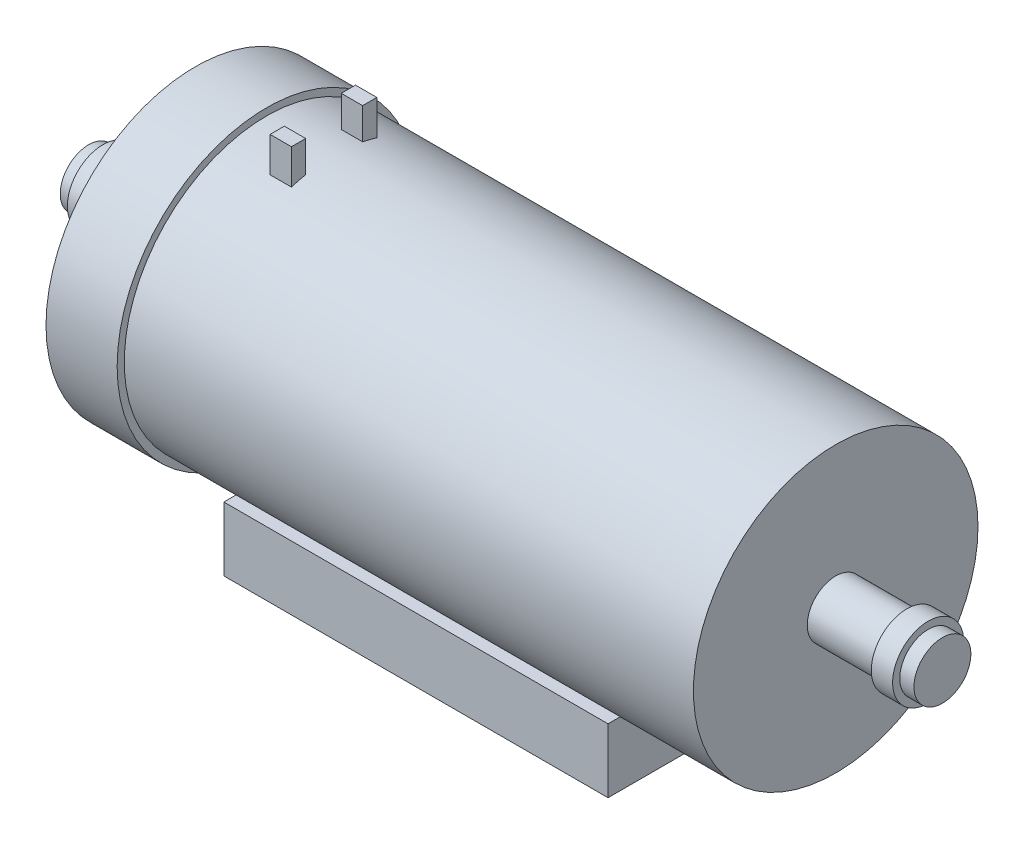
ISO-10303-21;
HEADER;
FILE_DESCRIPTION(('STEP AP214'),'2;1');
FILE_NAME('part.step','',(''),(''),'','','');
FILE_SCHEMA(('AUTOMOTIVE_DESIGN { 1 0 10303 214 1 1 1 1 }'));
ENDSEC;
DATA;
#1=APPLICATION_CONTEXT('core data for automotive mechanical design processes');
#2=APPLICATION_PROTOCOL_DEFINITION('international standard','automotive_design',2000,#1);
#3=PRODUCT_CONTEXT('',#1,'mechanical');
#4=PRODUCT('Part','Part','',(#3));
#5=PRODUCT_RELATED_PRODUCT_CATEGORY('part','',(#4));
#6=PRODUCT_DEFINITION_FORMATION('','',#4);
#7=PRODUCT_DEFINITION_CONTEXT('part definition',#1,'design');
#8=PRODUCT_DEFINITION('design','',#6,#7);
#9=PRODUCT_DEFINITION_SHAPE('','',#8);
#10=(LENGTH_UNIT() NAMED_UNIT(*) SI_UNIT(.MILLI.,.METRE.));
#11=(NAMED_UNIT(*) PLANE_ANGLE_UNIT() SI_UNIT($,.RADIAN.));
#12=(NAMED_UNIT(*) SI_UNIT($,.STERADIAN.) SOLID_ANGLE_UNIT());
#13=UNCERTAINTY_MEASURE_WITH_UNIT(LENGTH_MEASURE(1.E-05),#10,'distance_accuracy_value','');
#14=(GEOMETRIC_REPRESENTATION_CONTEXT(3) GLOBAL_UNCERTAINTY_ASSIGNED_CONTEXT((#13)) GLOBAL_UNIT_ASSIGNED_CONTEXT((#10,
#11,#12)) REPRESENTATION_CONTEXT('',''));
#15=CARTESIAN_POINT('',(0.,0.,0.));
#16=DIRECTION('',(0.,0.,1.));
#17=DIRECTION('',(1.,0.,0.));
#18=AXIS2_PLACEMENT_3D('',#15,#16,#17);
#19=CARTESIAN_POINT('',(45.,25.,0.));
#20=DIRECTION('',(-1.,0.,0.));
#21=DIRECTION('',(0.,0.,1.));
#22=AXIS2_PLACEMENT_3D('',#19,#20,#21);
#23=CYLINDRICAL_SURFACE('',#22,20.);
#24=CARTESIAN_POINT('',(-25.5,25.,0.));
#25=DIRECTION('',(-1.,0.,0.));
#26=DIRECTION('',(0.,0.,1.));
#27=AXIS2_PLACEMENT_3D('',#24,#25,#26);
#28=CIRCLE('',#27,20.);
#29=CARTESIAN_POINT('',(-25.5,44.5959179422654,-4.));
#30=VERTEX_POINT('',#29);
#31=CARTESIAN_POINT('',(-25.5,44.0787840283389,-6.));
#32=VERTEX_POINT('',#31);
#33=EDGE_CURVE('E345',#30,#32,#28,.T.);
#34=ORIENTED_EDGE('',*,*,#33,.F.);
#35=DIRECTION('',(-1.,0.,0.));
#36=VECTOR('',#35,1.);
#37=CARTESIAN_POINT('',(45.,44.5959179422654,-4.));
#38=LINE('',#37,#36);
#39=CARTESIAN_POINT('',(-28.5,44.5959179422654,-4.));
#40=VERTEX_POINT('',#39);
#41=EDGE_CURVE('E330',#40,#30,#38,.F.);
#42=ORIENTED_EDGE('',*,*,#41,.F.);
#43=CARTESIAN_POINT('',(-28.5,25.,0.));
#44=DIRECTION('',(1.,0.,0.));
#45=DIRECTION('',(0.,0.,-1.));
#46=AXIS2_PLACEMENT_3D('',#43,#44,#45);
#47=CIRCLE('',#46,20.);
#48=CARTESIAN_POINT('',(-28.5,44.0787840283389,-6.));
#49=VERTEX_POINT('',#48);
#50=EDGE_CURVE('E331',#49,#40,#47,.T.);
#51=ORIENTED_EDGE('',*,*,#50,.F.);
#52=DIRECTION('',(-1.,0.,0.));
#53=VECTOR('',#52,1.);
#54=CARTESIAN_POINT('',(45.,44.0787840283389,-6.));
#55=LINE('',#54,#53);
#56=EDGE_CURVE('E340',#32,#49,#55,.T.);
#57=ORIENTED_EDGE('',*,*,#56,.F.);
#58=EDGE_LOOP('',(#34,#42,#51,#57));
#59=FACE_BOUND('',#58,.T.);
#60=CARTESIAN_POINT('',(45.,25.,0.));
#61=DIRECTION('',(1.,0.,0.));
#62=DIRECTION('',(0.,0.,-1.));
#63=AXIS2_PLACEMENT_3D('',#60,#61,#62);
#64=CIRCLE('',#63,20.);
#65=CARTESIAN_POINT('',(45.,25.,-20.));
#66=VERTEX_POINT('',#65);
#67=EDGE_CURVE('E293',#66,#66,#64,.T.);
#68=ORIENTED_EDGE('',*,*,#67,.F.);
#69=EDGE_LOOP('',(#68));
#70=FACE_BOUND('',#69,.T.);
#71=CARTESIAN_POINT('',(-35.,25.,0.));
#72=DIRECTION('',(1.,0.,0.));
#73=DIRECTION('',(0.,0.,-1.));
#74=AXIS2_PLACEMENT_3D('',#71,#72,#73);
#75=CIRCLE('',#74,20.);
#76=CARTESIAN_POINT('',(-35.,25.,-20.));
#77=VERTEX_POINT('',#76);
#78=EDGE_CURVE('E292',#77,#77,#75,.T.);
#79=ORIENTED_EDGE('',*,*,#78,.T.);
#80=EDGE_LOOP('',(#79));
#81=FACE_BOUND('',#80,.T.);
#82=DIRECTION('',(-1.,0.,0.));
#83=VECTOR('',#82,1.);
#84=CARTESIAN_POINT('',(45.,9.,12.));
#85=LINE('',#84,#83);
#86=CARTESIAN_POINT('',(27.,9.,12.));
#87=VERTEX_POINT('',#86);
#88=CARTESIAN_POINT('',(-27.,9.,12.));
#89=VERTEX_POINT('',#88);
#90=EDGE_CURVE('E234',#87,#89,#85,.T.);
#91=ORIENTED_EDGE('',*,*,#90,.F.);
#92=CARTESIAN_POINT('',(27.,25.,0.));
#93=DIRECTION('',(-1.,0.,0.));
#94=DIRECTION('',(0.,0.,1.));
#95=AXIS2_PLACEMENT_3D('',#92,#93,#94);
#96=CIRCLE('',#95,20.);
#97=CARTESIAN_POINT('',(27.,9.,-12.));
#98=VERTEX_POINT('',#97);
#99=EDGE_CURVE('E309',#98,#87,#96,.T.);
#100=ORIENTED_EDGE('',*,*,#99,.F.);
#101=DIRECTION('',(-1.,0.,0.));
#102=VECTOR('',#101,1.);
#103=CARTESIAN_POINT('',(45.,9.,-12.));
#104=LINE('',#103,#102);
#105=CARTESIAN_POINT('',(-27.,9.,-12.));
#106=VERTEX_POINT('',#105);
#107=EDGE_CURVE('E296',#106,#98,#104,.F.);
#108=ORIENTED_EDGE('',*,*,#107,.F.);
#109=CARTESIAN_POINT('',(-27.,25.,0.));
#110=DIRECTION('',(1.,0.,0.));
#111=DIRECTION('',(0.,0.,-1.));
#112=AXIS2_PLACEMENT_3D('',#109,#110,#111);
#113=CIRCLE('',#112,20.);
#114=EDGE_CURVE('E308',#89,#106,#113,.T.);
#115=ORIENTED_EDGE('',*,*,#114,.F.);
#116=EDGE_LOOP('',(#91,#100,#108,#115));
#117=FACE_BOUND('',#116,.T.);
#118=CARTESIAN_POINT('',(-25.5,25.,0.));
#119=DIRECTION('',(-1.,0.,0.));
#120=DIRECTION('',(0.,0.,1.));
#121=AXIS2_PLACEMENT_3D('',#118,#119,#120);
#122=CIRCLE('',#121,20.);
#123=CARTESIAN_POINT('',(-25.5,44.0787840283389,6.));
#124=VERTEX_POINT('',#123);
#125=CARTESIAN_POINT('',(-25.5,44.5959179422654,4.));
#126=VERTEX_POINT('',#125);
#127=EDGE_CURVE('E11',#124,#126,#122,.T.);
#128=ORIENTED_EDGE('',*,*,#127,.F.);
#129=DIRECTION('',(-1.,0.,0.));
#130=VECTOR('',#129,1.);
#131=CARTESIAN_POINT('',(45.,44.0787840283389,6.));
#132=LINE('',#131,#130);
#133=CARTESIAN_POINT('',(-28.5,44.0787840283389,6.));
#134=VERTEX_POINT('',#133);
#135=EDGE_CURVE('E347',#134,#124,#132,.F.);
#136=ORIENTED_EDGE('',*,*,#135,.F.);
#137=CARTESIAN_POINT('',(-28.5,25.,0.));
#138=DIRECTION('',(1.,0.,0.));
#139=DIRECTION('',(0.,0.,-1.));
#140=AXIS2_PLACEMENT_3D('',#137,#138,#139);
#141=CIRCLE('',#140,20.);
#142=CARTESIAN_POINT('',(-28.5,44.5959179422654,4.));
#143=VERTEX_POINT('',#142);
#144=EDGE_CURVE('E70',#143,#134,#141,.T.);
#145=ORIENTED_EDGE('',*,*,#144,.F.);
#146=DIRECTION('',(-1.,0.,0.));
#147=VECTOR('',#146,1.);
#148=CARTESIAN_POINT('',(45.,44.5959179422654,4.));
#149=LINE('',#148,#147);
#150=EDGE_CURVE('E60',#126,#143,#149,.T.);
#151=ORIENTED_EDGE('',*,*,#150,.F.);
#152=EDGE_LOOP('',(#128,#136,#145,#151));
#153=FACE_BOUND('',#152,.T.);
#154=ADVANCED_FACE('F47',(#59,#70,#81,#117,#153),#23,.T.);
#155=CARTESIAN_POINT('',(60.,25.,0.));
#156=DIRECTION('',(-1.,0.,0.));
#157=DIRECTION('',(0.,0.,1.));
#158=AXIS2_PLACEMENT_3D('',#155,#156,#157);
#159=CYLINDRICAL_SURFACE('',#158,4.);
#160=CARTESIAN_POINT('',(45.,25.,0.));
#161=DIRECTION('',(1.,0.,0.));
#162=DIRECTION('',(0.,0.,-1.));
#163=AXIS2_PLACEMENT_3D('',#160,#161,#162);
#164=CIRCLE('',#163,4.);
#165=CARTESIAN_POINT('',(45.,25.,-4.));
#166=VERTEX_POINT('',#165);
#167=EDGE_CURVE('E230',#166,#166,#164,.T.);
#168=ORIENTED_EDGE('',*,*,#167,.T.);
#169=EDGE_LOOP('',(#168));
#170=FACE_BOUND('',#169,.T.);
#171=CARTESIAN_POINT('',(55.,25.,0.));
#172=DIRECTION('',(1.,0.,0.));
#173=DIRECTION('',(0.,0.,-1.));
#174=AXIS2_PLACEMENT_3D('',#171,#172,#173);
#175=CIRCLE('',#174,4.);
#176=CARTESIAN_POINT('',(55.,25.,-4.));
#177=VERTEX_POINT('',#176);
#178=EDGE_CURVE('E319',#177,#177,#175,.T.);
#179=ORIENTED_EDGE('',*,*,#178,.F.);
#180=EDGE_LOOP('',(#179));
#181=FACE_BOUND('',#180,.T.);
#182=ADVANCED_FACE('F370',(#170,#181),#159,.T.);
#183=CARTESIAN_POINT('',(45.,25.,0.));
#184=DIRECTION('',(1.,0.,0.));
#185=DIRECTION('',(0.,0.,-1.));
#186=AXIS2_PLACEMENT_3D('',#183,#184,#185);
#187=PLANE('',#186);
#188=ORIENTED_EDGE('',*,*,#167,.F.);
#189=EDGE_LOOP('',(#188));
#190=FACE_BOUND('',#189,.T.);
#191=ORIENTED_EDGE('',*,*,#67,.T.);
#192=EDGE_LOOP('',(#191));
#193=FACE_BOUND('',#192,.T.);
#194=ADVANCED_FACE('F372',(#190,#193),#187,.T.);
#195=CARTESIAN_POINT('',(-35.,25.,0.));
#196=DIRECTION('',(-1.,0.,0.));
#197=DIRECTION('',(0.,0.,1.));
#198=AXIS2_PLACEMENT_3D('',#195,#196,#197);
#199=CYLINDRICAL_SURFACE('',#198,21.);
#200=CARTESIAN_POINT('',(-35.,25.,0.));
#201=DIRECTION('',(1.,0.,0.));
#202=DIRECTION('',(0.,0.,-1.));
#203=AXIS2_PLACEMENT_3D('',#200,#201,#202);
#204=CIRCLE('',#203,21.);
#205=CARTESIAN_POINT('',(-35.,25.,-21.));
#206=VERTEX_POINT('',#205);
#207=EDGE_CURVE('E290',#206,#206,#204,.T.);
#208=ORIENTED_EDGE('',*,*,#207,.F.);
#209=EDGE_LOOP('',(#208));
#210=FACE_BOUND('',#209,.T.);
#211=CARTESIAN_POINT('',(-45.,25.,0.));
#212=DIRECTION('',(1.,0.,0.));
#213=DIRECTION('',(0.,0.,-1.));
#214=AXIS2_PLACEMENT_3D('',#211,#212,#213);
#215=CIRCLE('',#214,21.);
#216=CARTESIAN_POINT('',(-45.,25.,-21.));
#217=VERTEX_POINT('',#216);
#218=EDGE_CURVE('E287',#217,#217,#215,.T.);
#219=ORIENTED_EDGE('',*,*,#218,.T.);
#220=EDGE_LOOP('',(#219));
#221=FACE_BOUND('',#220,.T.);
#222=ADVANCED_FACE('F428',(#210,#221),#199,.T.);
#223=CARTESIAN_POINT('',(-35.,25.,0.));
#224=DIRECTION('',(1.,0.,0.));
#225=DIRECTION('',(0.,0.,-1.));
#226=AXIS2_PLACEMENT_3D('',#223,#224,#225);
#227=PLANE('',#226);
#228=ORIENTED_EDGE('',*,*,#78,.F.);
#229=EDGE_LOOP('',(#228));
#230=FACE_BOUND('',#229,.T.);
#231=ORIENTED_EDGE('',*,*,#207,.T.);
#232=EDGE_LOOP('',(#231));
#233=FACE_BOUND('',#232,.T.);
#234=ADVANCED_FACE('F424',(#230,#233),#227,.T.);
#235=CARTESIAN_POINT('',(-45.,25.,0.));
#236=DIRECTION('',(1.,0.,0.));
#237=DIRECTION('',(0.,0.,-1.));
#238=AXIS2_PLACEMENT_3D('',#235,#236,#237);
#239=PLANE('',#238);
#240=CARTESIAN_POINT('',(-45.,25.,0.));
#241=DIRECTION('',(1.,0.,0.));
#242=DIRECTION('',(0.,0.,-1.));
#243=AXIS2_PLACEMENT_3D('',#240,#241,#242);
#244=CIRCLE('',#243,4.);
#245=CARTESIAN_POINT('',(-45.,25.,-4.));
#246=VERTEX_POINT('',#245);
#247=EDGE_CURVE('E231',#246,#246,#244,.T.);
#248=ORIENTED_EDGE('',*,*,#247,.T.);
#249=EDGE_LOOP('',(#248));
#250=FACE_BOUND('',#249,.T.);
#251=ORIENTED_EDGE('',*,*,#218,.F.);
#252=EDGE_LOOP('',(#251));
#253=FACE_BOUND('',#252,.T.);
#254=ADVANCED_FACE('F430',(#250,#253),#239,.F.);
#255=CARTESIAN_POINT('',(0.,9.,0.));
#256=DIRECTION('',(0.,-1.,0.));
#257=DIRECTION('',(0.,0.,-1.));
#258=AXIS2_PLACEMENT_3D('',#255,#256,#257);
#259=PLANE('',#258);
#260=DIRECTION('',(0.,0.,-1.));
#261=VECTOR('',#260,1.);
#262=CARTESIAN_POINT('',(27.,9.,14.));
#263=LINE('',#262,#261);
#264=CARTESIAN_POINT('',(27.,9.,14.));
#265=VERTEX_POINT('',#264);
#266=EDGE_CURVE('E244',#265,#87,#263,.T.);
#267=ORIENTED_EDGE('',*,*,#266,.T.);
#268=ORIENTED_EDGE('',*,*,#90,.T.);
#269=DIRECTION('',(0.,0.,1.));
#270=VECTOR('',#269,1.);
#271=CARTESIAN_POINT('',(-27.,9.,14.));
#272=LINE('',#271,#270);
#273=CARTESIAN_POINT('',(-27.,9.,14.));
#274=VERTEX_POINT('',#273);
#275=EDGE_CURVE('E248',#89,#274,#272,.T.);
#276=ORIENTED_EDGE('',*,*,#275,.T.);
#277=DIRECTION('',(1.,0.,0.));
#278=VECTOR('',#277,1.);
#279=CARTESIAN_POINT('',(-27.,9.,14.));
#280=LINE('',#279,#278);
#281=EDGE_CURVE('E254',#274,#265,#280,.T.);
#282=ORIENTED_EDGE('',*,*,#281,.T.);
#283=EDGE_LOOP('',(#267,#268,#276,#282));
#284=FACE_BOUND('',#283,.T.);
#285=ADVANCED_FACE('F388',(#284),#259,.F.);
#286=CARTESIAN_POINT('',(-27.,9.,-14.));
#287=VERTEX_POINT('',#286);
#288=EDGE_CURVE('E253',#287,#106,#272,.T.);
#289=ORIENTED_EDGE('',*,*,#288,.T.);
#290=ORIENTED_EDGE('',*,*,#107,.T.);
#291=CARTESIAN_POINT('',(27.,9.,-14.));
#292=VERTEX_POINT('',#291);
#293=EDGE_CURVE('E250',#98,#292,#263,.T.);
#294=ORIENTED_EDGE('',*,*,#293,.T.);
#295=DIRECTION('',(-1.,0.,0.));
#296=VECTOR('',#295,1.);
#297=CARTESIAN_POINT('',(-27.,9.,-14.));
#298=LINE('',#297,#296);
#299=EDGE_CURVE('E247',#292,#287,#298,.T.);
#300=ORIENTED_EDGE('',*,*,#299,.T.);
#301=EDGE_LOOP('',(#289,#290,#294,#300));
#302=FACE_BOUND('',#301,.T.);
#303=ADVANCED_FACE('F409',(#302),#259,.F.);
#304=CARTESIAN_POINT('',(27.,9.,14.));
#305=DIRECTION('',(-1.,0.,0.));
#306=DIRECTION('',(0.,0.,1.));
#307=AXIS2_PLACEMENT_3D('',#304,#305,#306);
#308=PLANE('',#307);
#309=ORIENTED_EDGE('',*,*,#293,.F.);
#310=ORIENTED_EDGE('',*,*,#99,.T.);
#311=ORIENTED_EDGE('',*,*,#266,.F.);
#312=DIRECTION('',(0.,-1.,0.));
#313=VECTOR('',#312,1.);
#314=CARTESIAN_POINT('',(27.,9.,14.));
#315=LINE('',#314,#313);
#316=CARTESIAN_POINT('',(27.,0.,14.));
#317=VERTEX_POINT('',#316);
#318=EDGE_CURVE('E256',#265,#317,#315,.T.);
#319=ORIENTED_EDGE('',*,*,#318,.T.);
#320=DIRECTION('',(0.,0.,-1.));
#321=VECTOR('',#320,1.);
#322=CARTESIAN_POINT('',(27.,0.,14.));
#323=LINE('',#322,#321);
#324=CARTESIAN_POINT('',(27.,0.,-14.));
#325=VERTEX_POINT('',#324);
#326=EDGE_CURVE('E236',#317,#325,#323,.T.);
#327=ORIENTED_EDGE('',*,*,#326,.T.);
#328=DIRECTION('',(0.,-1.,0.));
#329=VECTOR('',#328,1.);
#330=CARTESIAN_POINT('',(27.,9.,-14.));
#331=LINE('',#330,#329);
#332=EDGE_CURVE('E284',#292,#325,#331,.T.);
#333=ORIENTED_EDGE('',*,*,#332,.F.);
#334=EDGE_LOOP('',(#309,#310,#311,#319,#327,#333));
#335=FACE_BOUND('',#334,.T.);
#336=ADVANCED_FACE('F389',(#335),#308,.F.);
#337=CARTESIAN_POINT('',(-27.,9.,-14.));
#338=DIRECTION('',(0.,0.,1.));
#339=DIRECTION('',(1.,0.,0.));
#340=AXIS2_PLACEMENT_3D('',#337,#338,#339);
#341=PLANE('',#340);
#342=DIRECTION('',(-1.,0.,0.));
#343=VECTOR('',#342,1.);
#344=CARTESIAN_POINT('',(-27.,0.,-14.));
#345=LINE('',#344,#343);
#346=CARTESIAN_POINT('',(-27.,0.,-14.));
#347=VERTEX_POINT('',#346);
#348=EDGE_CURVE('E265',#325,#347,#345,.T.);
#349=ORIENTED_EDGE('',*,*,#348,.T.);
#350=DIRECTION('',(0.,-1.,0.));
#351=VECTOR('',#350,1.);
#352=CARTESIAN_POINT('',(-27.,9.,-14.));
#353=LINE('',#352,#351);
#354=EDGE_CURVE('E279',#287,#347,#353,.T.);
#355=ORIENTED_EDGE('',*,*,#354,.F.);
#356=ORIENTED_EDGE('',*,*,#299,.F.);
#357=ORIENTED_EDGE('',*,*,#332,.T.);
#358=EDGE_LOOP('',(#349,#355,#356,#357));
#359=FACE_BOUND('',#358,.T.);
#360=ADVANCED_FACE('F404',(#359),#341,.F.);
#361=CARTESIAN_POINT('',(-27.,9.,14.));
#362=DIRECTION('',(1.,0.,0.));
#363=DIRECTION('',(0.,0.,-1.));
#364=AXIS2_PLACEMENT_3D('',#361,#362,#363);
#365=PLANE('',#364);
#366=ORIENTED_EDGE('',*,*,#275,.F.);
#367=ORIENTED_EDGE('',*,*,#114,.T.);
#368=ORIENTED_EDGE('',*,*,#288,.F.);
#369=ORIENTED_EDGE('',*,*,#354,.T.);
#370=DIRECTION('',(0.,0.,1.));
#371=VECTOR('',#370,1.);
#372=CARTESIAN_POINT('',(-27.,0.,14.));
#373=LINE('',#372,#371);
#374=CARTESIAN_POINT('',(-27.,0.,14.));
#375=VERTEX_POINT('',#374);
#376=EDGE_CURVE('E264',#347,#375,#373,.T.);
#377=ORIENTED_EDGE('',*,*,#376,.T.);
#378=DIRECTION('',(0.,-1.,0.));
#379=VECTOR('',#378,1.);
#380=CARTESIAN_POINT('',(-27.,9.,14.));
#381=LINE('',#380,#379);
#382=EDGE_CURVE('E273',#274,#375,#381,.T.);
#383=ORIENTED_EDGE('',*,*,#382,.F.);
#384=EDGE_LOOP('',(#366,#367,#368,#369,#377,#383));
#385=FACE_BOUND('',#384,.T.);
#386=ADVANCED_FACE('F412',(#385),#365,.F.);
#387=CARTESIAN_POINT('',(-27.,9.,14.));
#388=DIRECTION('',(0.,0.,-1.));
#389=DIRECTION('',(-1.,0.,0.));
#390=AXIS2_PLACEMENT_3D('',#387,#388,#389);
#391=PLANE('',#390);
#392=DIRECTION('',(1.,0.,0.));
#393=VECTOR('',#392,1.);
#394=CARTESIAN_POINT('',(-27.,0.,14.));
#395=LINE('',#394,#393);
#396=EDGE_CURVE('E268',#375,#317,#395,.T.);
#397=ORIENTED_EDGE('',*,*,#396,.T.);
#398=ORIENTED_EDGE('',*,*,#318,.F.);
#399=ORIENTED_EDGE('',*,*,#281,.F.);
#400=ORIENTED_EDGE('',*,*,#382,.T.);
#401=EDGE_LOOP('',(#397,#398,#399,#400));
#402=FACE_BOUND('',#401,.T.);
#403=ADVANCED_FACE('F393',(#402),#391,.F.);
#404=CARTESIAN_POINT('',(0.,0.,0.));
#405=DIRECTION('',(0.,-1.,0.));
#406=DIRECTION('',(0.,0.,-1.));
#407=AXIS2_PLACEMENT_3D('',#404,#405,#406);
#408=PLANE('',#407);
#409=ORIENTED_EDGE('',*,*,#326,.F.);
#410=ORIENTED_EDGE('',*,*,#396,.F.);
#411=ORIENTED_EDGE('',*,*,#376,.F.);
#412=ORIENTED_EDGE('',*,*,#348,.F.);
#413=EDGE_LOOP('',(#409,#410,#411,#412));
#414=FACE_BOUND('',#413,.T.);
#415=ADVANCED_FACE('F396',(#414),#408,.T.);
#416=CARTESIAN_POINT('',(-45.,25.,0.));
#417=DIRECTION('',(-1.,0.,0.));
#418=DIRECTION('',(0.,0.,1.));
#419=AXIS2_PLACEMENT_3D('',#416,#417,#418);
#420=CYLINDRICAL_SURFACE('',#419,4.);
#421=CARTESIAN_POINT('',(-55.,25.,0.));
#422=DIRECTION('',(1.,0.,0.));
#423=DIRECTION('',(0.,0.,-1.));
#424=AXIS2_PLACEMENT_3D('',#421,#422,#423);
#425=CIRCLE('',#424,4.);
#426=CARTESIAN_POINT('',(-55.,25.,-4.));
#427=VERTEX_POINT('',#426);
#428=EDGE_CURVE('E217',#427,#427,#425,.T.);
#429=ORIENTED_EDGE('',*,*,#428,.T.);
#430=EDGE_LOOP('',(#429));
#431=FACE_BOUND('',#430,.T.);
#432=ORIENTED_EDGE('',*,*,#247,.F.);
#433=EDGE_LOOP('',(#432));
#434=FACE_BOUND('',#433,.T.);
#435=ADVANCED_FACE('F450',(#431,#434),#420,.T.);
#436=CARTESIAN_POINT('',(-55.,25.,0.));
#437=DIRECTION('',(-1.,0.,0.));
#438=DIRECTION('',(0.,0.,1.));
#439=AXIS2_PLACEMENT_3D('',#436,#437,#438);
#440=CYLINDRICAL_SURFACE('',#439,5.);
#441=CARTESIAN_POINT('',(-55.,25.,0.));
#442=DIRECTION('',(1.,0.,0.));
#443=DIRECTION('',(0.,0.,-1.));
#444=AXIS2_PLACEMENT_3D('',#441,#442,#443);
#445=CIRCLE('',#444,5.);
#446=CARTESIAN_POINT('',(-55.,25.,-5.));
#447=VERTEX_POINT('',#446);
#448=EDGE_CURVE('E212',#447,#447,#445,.T.);
#449=ORIENTED_EDGE('',*,*,#448,.F.);
#450=EDGE_LOOP('',(#449));
#451=FACE_BOUND('',#450,.T.);
#452=CARTESIAN_POINT('',(-58.,25.,0.));
#453=DIRECTION('',(1.,0.,0.));
#454=DIRECTION('',(0.,0.,-1.));
#455=AXIS2_PLACEMENT_3D('',#452,#453,#454);
#456=CIRCLE('',#455,5.);
#457=CARTESIAN_POINT('',(-58.,25.,-5.));
#458=VERTEX_POINT('',#457);
#459=EDGE_CURVE('E218',#458,#458,#456,.T.);
#460=ORIENTED_EDGE('',*,*,#459,.T.);
#461=EDGE_LOOP('',(#460));
#462=FACE_BOUND('',#461,.T.);
#463=ADVANCED_FACE('F448',(#451,#462),#440,.T.);
#464=CARTESIAN_POINT('',(-55.,25.,0.));
#465=DIRECTION('',(1.,0.,0.));
#466=DIRECTION('',(0.,0.,-1.));
#467=AXIS2_PLACEMENT_3D('',#464,#465,#466);
#468=PLANE('',#467);
#469=ORIENTED_EDGE('',*,*,#428,.F.);
#470=EDGE_LOOP('',(#469));
#471=FACE_BOUND('',#470,.T.);
#472=ORIENTED_EDGE('',*,*,#448,.T.);
#473=EDGE_LOOP('',(#472));
#474=FACE_BOUND('',#473,.T.);
#475=ADVANCED_FACE('F456',(#471,#474),#468,.T.);
#476=CARTESIAN_POINT('',(-58.,25.,0.));
#477=DIRECTION('',(1.,0.,0.));
#478=DIRECTION('',(0.,0.,-1.));
#479=AXIS2_PLACEMENT_3D('',#476,#477,#478);
#480=PLANE('',#479);
#481=CARTESIAN_POINT('',(-58.,25.,0.));
#482=DIRECTION('',(1.,0.,0.));
#483=DIRECTION('',(0.,0.,-1.));
#484=AXIS2_PLACEMENT_3D('',#481,#482,#483);
#485=CIRCLE('',#484,4.);
#486=CARTESIAN_POINT('',(-58.,25.,-4.));
#487=VERTEX_POINT('',#486);
#488=EDGE_CURVE('E235',#487,#487,#485,.T.);
#489=ORIENTED_EDGE('',*,*,#488,.T.);
#490=EDGE_LOOP('',(#489));
#491=FACE_BOUND('',#490,.T.);
#492=ORIENTED_EDGE('',*,*,#459,.F.);
#493=EDGE_LOOP('',(#492));
#494=FACE_BOUND('',#493,.T.);
#495=ADVANCED_FACE('F471',(#491,#494),#480,.F.);
#496=CARTESIAN_POINT('',(-60.,25.,0.));
#497=DIRECTION('',(1.,0.,0.));
#498=DIRECTION('',(0.,0.,-1.));
#499=AXIS2_PLACEMENT_3D('',#496,#497,#498);
#500=PLANE('',#499);
#501=CARTESIAN_POINT('',(-60.,25.,0.));
#502=DIRECTION('',(1.,0.,0.));
#503=DIRECTION('',(0.,0.,-1.));
#504=AXIS2_PLACEMENT_3D('',#501,#502,#503);
#505=CIRCLE('',#504,4.);
#506=CARTESIAN_POINT('',(-60.,25.,-4.));
#507=VERTEX_POINT('',#506);
#508=EDGE_CURVE('E229',#507,#507,#505,.T.);
#509=ORIENTED_EDGE('',*,*,#508,.F.);
#510=EDGE_LOOP('',(#509));
#511=FACE_BOUND('',#510,.T.);
#512=ADVANCED_FACE('F461',(#511),#500,.F.);
#513=ORIENTED_EDGE('',*,*,#508,.T.);
#514=EDGE_LOOP('',(#513));
#515=FACE_BOUND('',#514,.T.);
#516=ORIENTED_EDGE('',*,*,#488,.F.);
#517=EDGE_LOOP('',(#516));
#518=FACE_BOUND('',#517,.T.);
#519=ADVANCED_FACE('F454',(#515,#518),#420,.T.);
#520=CARTESIAN_POINT('',(58.,25.,0.));
#521=DIRECTION('',(-1.,0.,0.));
#522=DIRECTION('',(0.,0.,1.));
#523=AXIS2_PLACEMENT_3D('',#520,#521,#522);
#524=CYLINDRICAL_SURFACE('',#523,5.);
#525=CARTESIAN_POINT('',(58.,25.,0.));
#526=DIRECTION('',(1.,0.,0.));
#527=DIRECTION('',(0.,0.,-1.));
#528=AXIS2_PLACEMENT_3D('',#525,#526,#527);
#529=CIRCLE('',#528,5.);
#530=CARTESIAN_POINT('',(58.,25.,-5.));
#531=VERTEX_POINT('',#530);
#532=EDGE_CURVE('E206',#531,#531,#529,.T.);
#533=ORIENTED_EDGE('',*,*,#532,.F.);
#534=EDGE_LOOP('',(#533));
#535=FACE_BOUND('',#534,.T.);
#536=CARTESIAN_POINT('',(55.,25.,0.));
#537=DIRECTION('',(1.,0.,0.));
#538=DIRECTION('',(0.,0.,-1.));
#539=AXIS2_PLACEMENT_3D('',#536,#537,#538);
#540=CIRCLE('',#539,5.);
#541=CARTESIAN_POINT('',(55.,25.,-5.));
#542=VERTEX_POINT('',#541);
#543=EDGE_CURVE('E202',#542,#542,#540,.T.);
#544=ORIENTED_EDGE('',*,*,#543,.T.);
#545=EDGE_LOOP('',(#544));
#546=FACE_BOUND('',#545,.T.);
#547=ADVANCED_FACE('F465',(#535,#546),#524,.T.);
#548=CARTESIAN_POINT('',(58.,25.,0.));
#549=DIRECTION('',(1.,0.,0.));
#550=DIRECTION('',(0.,0.,-1.));
#551=AXIS2_PLACEMENT_3D('',#548,#549,#550);
#552=PLANE('',#551);
#553=CARTESIAN_POINT('',(58.,25.,0.));
#554=DIRECTION('',(1.,0.,0.));
#555=DIRECTION('',(0.,0.,-1.));
#556=AXIS2_PLACEMENT_3D('',#553,#554,#555);
#557=CIRCLE('',#556,4.);
#558=CARTESIAN_POINT('',(58.,25.,-4.));
#559=VERTEX_POINT('',#558);
#560=EDGE_CURVE('E209',#559,#559,#557,.T.);
#561=ORIENTED_EDGE('',*,*,#560,.F.);
#562=EDGE_LOOP('',(#561));
#563=FACE_BOUND('',#562,.T.);
#564=ORIENTED_EDGE('',*,*,#532,.T.);
#565=EDGE_LOOP('',(#564));
#566=FACE_BOUND('',#565,.T.);
#567=ADVANCED_FACE('F468',(#563,#566),#552,.T.);
#568=CARTESIAN_POINT('',(55.,25.,0.));
#569=DIRECTION('',(1.,0.,0.));
#570=DIRECTION('',(0.,0.,-1.));
#571=AXIS2_PLACEMENT_3D('',#568,#569,#570);
#572=PLANE('',#571);
#573=ORIENTED_EDGE('',*,*,#178,.T.);
#574=EDGE_LOOP('',(#573));
#575=FACE_BOUND('',#574,.T.);
#576=ORIENTED_EDGE('',*,*,#543,.F.);
#577=EDGE_LOOP('',(#576));
#578=FACE_BOUND('',#577,.T.);
#579=ADVANCED_FACE('F495',(#575,#578),#572,.F.);
#580=CARTESIAN_POINT('',(60.,25.,0.));
#581=DIRECTION('',(1.,0.,0.));
#582=DIRECTION('',(0.,0.,-1.));
#583=AXIS2_PLACEMENT_3D('',#580,#581,#582);
#584=PLANE('',#583);
#585=CARTESIAN_POINT('',(60.,25.,0.));
#586=DIRECTION('',(1.,0.,0.));
#587=DIRECTION('',(0.,0.,-1.));
#588=AXIS2_PLACEMENT_3D('',#585,#586,#587);
#589=CIRCLE('',#588,4.);
#590=CARTESIAN_POINT('',(60.,25.,-4.));
#591=VERTEX_POINT('',#590);
#592=EDGE_CURVE('E224',#591,#591,#589,.T.);
#593=ORIENTED_EDGE('',*,*,#592,.T.);
#594=EDGE_LOOP('',(#593));
#595=FACE_BOUND('',#594,.T.);
#596=ADVANCED_FACE('F489',(#595),#584,.T.);
#597=ORIENTED_EDGE('',*,*,#560,.T.);
#598=EDGE_LOOP('',(#597));
#599=FACE_BOUND('',#598,.T.);
#600=ORIENTED_EDGE('',*,*,#592,.F.);
#601=EDGE_LOOP('',(#600));
#602=FACE_BOUND('',#601,.T.);
#603=ADVANCED_FACE('F380',(#599,#602),#159,.T.);
#604=CARTESIAN_POINT('',(-28.5,49.,-6.));
#605=DIRECTION('',(0.,0.,1.));
#606=DIRECTION('',(1.,0.,0.));
#607=AXIS2_PLACEMENT_3D('',#604,#605,#606);
#608=PLANE('',#607);
#609=DIRECTION('',(0.,-1.,0.));
#610=VECTOR('',#609,1.);
#611=CARTESIAN_POINT('',(-25.5,49.,-6.));
#612=LINE('',#611,#610);
#613=CARTESIAN_POINT('',(-25.5,49.,-6.));
#614=VERTEX_POINT('',#613);
#615=EDGE_CURVE('E203',#614,#32,#612,.T.);
#616=ORIENTED_EDGE('',*,*,#615,.T.);
#617=ORIENTED_EDGE('',*,*,#56,.T.);
#618=DIRECTION('',(0.,-1.,0.));
#619=VECTOR('',#618,1.);
#620=CARTESIAN_POINT('',(-28.5,49.,-6.));
#621=LINE('',#620,#619);
#622=CARTESIAN_POINT('',(-28.5,49.,-6.));
#623=VERTEX_POINT('',#622);
#624=EDGE_CURVE('E197',#623,#49,#621,.T.);
#625=ORIENTED_EDGE('',*,*,#624,.F.);
#626=DIRECTION('',(-1.,0.,0.));
#627=VECTOR('',#626,1.);
#628=CARTESIAN_POINT('',(-28.5,49.,-6.));
#629=LINE('',#628,#627);
#630=EDGE_CURVE('E173',#614,#623,#629,.T.);
#631=ORIENTED_EDGE('',*,*,#630,.F.);
#632=EDGE_LOOP('',(#616,#617,#625,#631));
#633=FACE_BOUND('',#632,.T.);
#634=ADVANCED_FACE('F494',(#633),#608,.F.);
#635=CARTESIAN_POINT('',(-28.5,49.,-4.));
#636=DIRECTION('',(0.,0.,-1.));
#637=DIRECTION('',(-1.,0.,0.));
#638=AXIS2_PLACEMENT_3D('',#635,#636,#637);
#639=PLANE('',#638);
#640=DIRECTION('',(0.,-1.,0.));
#641=VECTOR('',#640,1.);
#642=CARTESIAN_POINT('',(-28.5,49.,-4.));
#643=LINE('',#642,#641);
#644=CARTESIAN_POINT('',(-28.5,49.,-4.));
#645=VERTEX_POINT('',#644);
#646=EDGE_CURVE('E194',#645,#40,#643,.T.);
#647=ORIENTED_EDGE('',*,*,#646,.T.);
#648=ORIENTED_EDGE('',*,*,#41,.T.);
#649=DIRECTION('',(0.,-1.,0.));
#650=VECTOR('',#649,1.);
#651=CARTESIAN_POINT('',(-25.5,49.,-4.));
#652=LINE('',#651,#650);
#653=CARTESIAN_POINT('',(-25.5,49.,-4.));
#654=VERTEX_POINT('',#653);
#655=EDGE_CURVE('E186',#654,#30,#652,.T.);
#656=ORIENTED_EDGE('',*,*,#655,.F.);
#657=DIRECTION('',(1.,0.,0.));
#658=VECTOR('',#657,1.);
#659=CARTESIAN_POINT('',(-28.5,49.,-4.));
#660=LINE('',#659,#658);
#661=EDGE_CURVE('E187',#645,#654,#660,.T.);
#662=ORIENTED_EDGE('',*,*,#661,.F.);
#663=EDGE_LOOP('',(#647,#648,#656,#662));
#664=FACE_BOUND('',#663,.T.);
#665=ADVANCED_FACE('F498',(#664),#639,.F.);
#666=CARTESIAN_POINT('',(-25.5,49.,-4.));
#667=DIRECTION('',(-1.,0.,0.));
#668=DIRECTION('',(0.,0.,1.));
#669=AXIS2_PLACEMENT_3D('',#666,#667,#668);
#670=PLANE('',#669);
#671=ORIENTED_EDGE('',*,*,#655,.T.);
#672=ORIENTED_EDGE('',*,*,#33,.T.);
#673=ORIENTED_EDGE('',*,*,#615,.F.);
#674=DIRECTION('',(0.,0.,-1.));
#675=VECTOR('',#674,1.);
#676=CARTESIAN_POINT('',(-25.5,49.,-4.));
#677=LINE('',#676,#675);
#678=EDGE_CURVE('E168',#654,#614,#677,.T.);
#679=ORIENTED_EDGE('',*,*,#678,.F.);
#680=EDGE_LOOP('',(#671,#672,#673,#679));
#681=FACE_BOUND('',#680,.T.);
#682=ADVANCED_FACE('F518',(#681),#670,.F.);
#683=CARTESIAN_POINT('',(-28.5,49.,-4.));
#684=DIRECTION('',(1.,0.,0.));
#685=DIRECTION('',(0.,0.,-1.));
#686=AXIS2_PLACEMENT_3D('',#683,#684,#685);
#687=PLANE('',#686);
#688=ORIENTED_EDGE('',*,*,#624,.T.);
#689=ORIENTED_EDGE('',*,*,#50,.T.);
#690=ORIENTED_EDGE('',*,*,#646,.F.);
#691=DIRECTION('',(0.,0.,1.));
#692=VECTOR('',#691,1.);
#693=CARTESIAN_POINT('',(-28.5,49.,-4.));
#694=LINE('',#693,#692);
#695=EDGE_CURVE('E181',#623,#645,#694,.T.);
#696=ORIENTED_EDGE('',*,*,#695,.F.);
#697=EDGE_LOOP('',(#688,#689,#690,#696));
#698=FACE_BOUND('',#697,.T.);
#699=ADVANCED_FACE('F525',(#698),#687,.F.);
#700=CARTESIAN_POINT('',(0.,49.,0.));
#701=DIRECTION('',(0.,-1.,0.));
#702=DIRECTION('',(0.,0.,-1.));
#703=AXIS2_PLACEMENT_3D('',#700,#701,#702);
#704=PLANE('',#703);
#705=ORIENTED_EDGE('',*,*,#678,.T.);
#706=ORIENTED_EDGE('',*,*,#630,.T.);
#707=ORIENTED_EDGE('',*,*,#695,.T.);
#708=ORIENTED_EDGE('',*,*,#661,.T.);
#709=EDGE_LOOP('',(#705,#706,#707,#708));
#710=FACE_BOUND('',#709,.T.);
#711=ADVANCED_FACE('F527',(#710),#704,.F.);
#712=CARTESIAN_POINT('',(-28.5,49.,4.));
#713=DIRECTION('',(0.,0.,1.));
#714=DIRECTION('',(1.,0.,0.));
#715=AXIS2_PLACEMENT_3D('',#712,#713,#714);
#716=PLANE('',#715);
#717=DIRECTION('',(0.,-1.,0.));
#718=VECTOR('',#717,1.);
#719=CARTESIAN_POINT('',(-25.5,49.,4.));
#720=LINE('',#719,#718);
#721=CARTESIAN_POINT('',(-25.5,49.,4.));
#722=VERTEX_POINT('',#721);
#723=EDGE_CURVE('E147',#722,#126,#720,.T.);
#724=ORIENTED_EDGE('',*,*,#723,.T.);
#725=ORIENTED_EDGE('',*,*,#150,.T.);
#726=DIRECTION('',(0.,-1.,0.));
#727=VECTOR('',#726,1.);
#728=CARTESIAN_POINT('',(-28.5,49.,4.));
#729=LINE('',#728,#727);
#730=CARTESIAN_POINT('',(-28.5,49.,4.));
#731=VERTEX_POINT('',#730);
#732=EDGE_CURVE('E155',#731,#143,#729,.T.);
#733=ORIENTED_EDGE('',*,*,#732,.F.);
#734=DIRECTION('',(-1.,0.,0.));
#735=VECTOR('',#734,1.);
#736=CARTESIAN_POINT('',(-28.5,49.,4.));
#737=LINE('',#736,#735);
#738=EDGE_CURVE('E148',#722,#731,#737,.T.);
#739=ORIENTED_EDGE('',*,*,#738,.F.);
#740=EDGE_LOOP('',(#724,#725,#733,#739));
#741=FACE_BOUND('',#740,.T.);
#742=ADVANCED_FACE('F146',(#741),#716,.F.);
#743=CARTESIAN_POINT('',(-28.5,49.,6.));
#744=DIRECTION('',(0.,0.,-1.));
#745=DIRECTION('',(-1.,0.,0.));
#746=AXIS2_PLACEMENT_3D('',#743,#744,#745);
#747=PLANE('',#746);
#748=DIRECTION('',(0.,-1.,0.));
#749=VECTOR('',#748,1.);
#750=CARTESIAN_POINT('',(-28.5,49.,6.));
#751=LINE('',#750,#749);
#752=CARTESIAN_POINT('',(-28.5,49.,6.));
#753=VERTEX_POINT('',#752);
#754=EDGE_CURVE('E180',#753,#134,#751,.T.);
#755=ORIENTED_EDGE('',*,*,#754,.T.);
#756=ORIENTED_EDGE('',*,*,#135,.T.);
#757=DIRECTION('',(0.,-1.,0.));
#758=VECTOR('',#757,1.);
#759=CARTESIAN_POINT('',(-25.5,49.,6.));
#760=LINE('',#759,#758);
#761=CARTESIAN_POINT('',(-25.5,49.,6.));
#762=VERTEX_POINT('',#761);
#763=EDGE_CURVE('E356',#762,#124,#760,.T.);
#764=ORIENTED_EDGE('',*,*,#763,.F.);
#765=DIRECTION('',(1.,0.,0.));
#766=VECTOR('',#765,1.);
#767=CARTESIAN_POINT('',(-28.5,49.,6.));
#768=LINE('',#767,#766);
#769=EDGE_CURVE('E165',#753,#762,#768,.T.);
#770=ORIENTED_EDGE('',*,*,#769,.F.);
#771=EDGE_LOOP('',(#755,#756,#764,#770));
#772=FACE_BOUND('',#771,.T.);
#773=ADVANCED_FACE('F364',(#772),#747,.F.);
#774=CARTESIAN_POINT('',(-25.5,49.,6.));
#775=DIRECTION('',(-1.,0.,0.));
#776=DIRECTION('',(0.,0.,1.));
#777=AXIS2_PLACEMENT_3D('',#774,#775,#776);
#778=PLANE('',#777);
#779=ORIENTED_EDGE('',*,*,#763,.T.);
#780=ORIENTED_EDGE('',*,*,#127,.T.);
#781=ORIENTED_EDGE('',*,*,#723,.F.);
#782=DIRECTION('',(0.,0.,-1.));
#783=VECTOR('',#782,1.);
#784=CARTESIAN_POINT('',(-25.5,49.,6.));
#785=LINE('',#784,#783);
#786=EDGE_CURVE('E160',#762,#722,#785,.T.);
#787=ORIENTED_EDGE('',*,*,#786,.F.);
#788=EDGE_LOOP('',(#779,#780,#781,#787));
#789=FACE_BOUND('',#788,.T.);
#790=ADVANCED_FACE('F169',(#789),#778,.F.);
#791=CARTESIAN_POINT('',(-28.5,49.,6.));
#792=DIRECTION('',(1.,0.,0.));
#793=DIRECTION('',(0.,0.,-1.));
#794=AXIS2_PLACEMENT_3D('',#791,#792,#793);
#795=PLANE('',#794);
#796=ORIENTED_EDGE('',*,*,#732,.T.);
#797=ORIENTED_EDGE('',*,*,#144,.T.);
#798=ORIENTED_EDGE('',*,*,#754,.F.);
#799=DIRECTION('',(0.,0.,1.));
#800=VECTOR('',#799,1.);
#801=CARTESIAN_POINT('',(-28.5,49.,6.));
#802=LINE('',#801,#800);
#803=EDGE_CURVE('E156',#731,#753,#802,.T.);
#804=ORIENTED_EDGE('',*,*,#803,.F.);
#805=EDGE_LOOP('',(#796,#797,#798,#804));
#806=FACE_BOUND('',#805,.T.);
#807=ADVANCED_FACE('F355',(#806),#795,.F.);
#808=CARTESIAN_POINT('',(0.,49.,0.));
#809=DIRECTION('',(0.,-1.,0.));
#810=DIRECTION('',(0.,0.,-1.));
#811=AXIS2_PLACEMENT_3D('',#808,#809,#810);
#812=PLANE('',#811);
#813=ORIENTED_EDGE('',*,*,#786,.T.);
#814=ORIENTED_EDGE('',*,*,#738,.T.);
#815=ORIENTED_EDGE('',*,*,#803,.T.);
#816=ORIENTED_EDGE('',*,*,#769,.T.);
#817=EDGE_LOOP('',(#813,#814,#815,#816));
#818=FACE_BOUND('',#817,.T.);
#819=ADVANCED_FACE('F159',(#818),#812,.F.);
#820=CLOSED_SHELL('',(#154,#182,#194,#222,#234,#254,#285,#303,#336,#360,#386,#403,#415,#435,
#463,#475,#495,#512,#519,#547,#567,#579,#596,#603,#634,#665,#682,#699,#711,#742,#773,#790,#807,#819));
#821=MANIFOLD_SOLID_BREP('B2',#820);
#822=ADVANCED_BREP_SHAPE_REPRESENTATION('',(#18,#821),#14);
#823=SHAPE_DEFINITION_REPRESENTATION(#9,#822);
ENDSEC;
END-ISO-10303-21;
